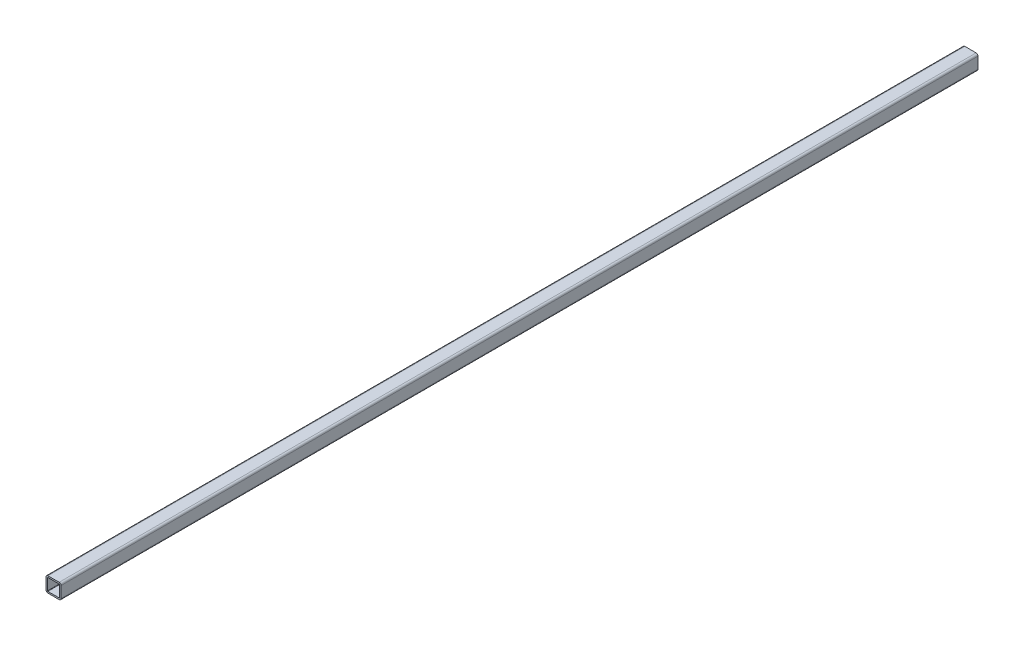
ISO-10303-21;
HEADER;
FILE_DESCRIPTION(('STEP AP214'),'2;1');
FILE_NAME('part.step','',(''),(''),'','','');
FILE_SCHEMA(('AUTOMOTIVE_DESIGN { 1 0 10303 214 1 1 1 1 }'));
ENDSEC;
DATA;
#1=APPLICATION_CONTEXT('core data for automotive mechanical design processes');
#2=APPLICATION_PROTOCOL_DEFINITION('international standard','automotive_design',2000,#1);
#3=PRODUCT_CONTEXT('',#1,'mechanical');
#4=PRODUCT('Part','Part','',(#3));
#5=PRODUCT_RELATED_PRODUCT_CATEGORY('part','',(#4));
#6=PRODUCT_DEFINITION_FORMATION('','',#4);
#7=PRODUCT_DEFINITION_CONTEXT('part definition',#1,'design');
#8=PRODUCT_DEFINITION('design','',#6,#7);
#9=PRODUCT_DEFINITION_SHAPE('','',#8);
#10=(LENGTH_UNIT() NAMED_UNIT(*) SI_UNIT(.MILLI.,.METRE.));
#11=(NAMED_UNIT(*) PLANE_ANGLE_UNIT() SI_UNIT($,.RADIAN.));
#12=(NAMED_UNIT(*) SI_UNIT($,.STERADIAN.) SOLID_ANGLE_UNIT());
#13=UNCERTAINTY_MEASURE_WITH_UNIT(LENGTH_MEASURE(1.E-05),#10,'distance_accuracy_value','');
#14=(GEOMETRIC_REPRESENTATION_CONTEXT(3) GLOBAL_UNCERTAINTY_ASSIGNED_CONTEXT((#13)) GLOBAL_UNIT_ASSIGNED_CONTEXT((#10,
#11,#12)) REPRESENTATION_CONTEXT('',''));
#15=CARTESIAN_POINT('',(0.,0.,0.));
#16=DIRECTION('',(0.,0.,1.));
#17=DIRECTION('',(1.,0.,0.));
#18=AXIS2_PLACEMENT_3D('',#15,#16,#17);
#19=CARTESIAN_POINT('',(-7.5,7.5,609.6));
#20=DIRECTION('',(0.,0.,1.));
#21=DIRECTION('',(1.,0.,0.));
#22=AXIS2_PLACEMENT_3D('',#19,#20,#21);
#23=PLANE('',#22);
#24=CARTESIAN_POINT('',(-7.5,7.5,609.6));
#25=DIRECTION('',(0.,0.,1.));
#26=DIRECTION('',(1.,0.,0.));
#27=AXIS2_PLACEMENT_3D('',#24,#25,#26);
#28=CIRCLE('',#27,2.5);
#29=CARTESIAN_POINT('',(-7.5,10.,609.6));
#30=VERTEX_POINT('',#29);
#31=CARTESIAN_POINT('',(-10.,7.5,609.6));
#32=VERTEX_POINT('',#31);
#33=EDGE_CURVE('E256',#30,#32,#28,.T.);
#34=ORIENTED_EDGE('',*,*,#33,.T.);
#35=DIRECTION('',(0.,-1.,0.));
#36=VECTOR('',#35,1.);
#37=CARTESIAN_POINT('',(-10.,-7.5,609.6));
#38=LINE('',#37,#36);
#39=CARTESIAN_POINT('',(-10.,-7.5,609.6));
#40=VERTEX_POINT('',#39);
#41=EDGE_CURVE('E259',#32,#40,#38,.T.);
#42=ORIENTED_EDGE('',*,*,#41,.T.);
#43=CARTESIAN_POINT('',(-7.5,-7.5,609.6));
#44=DIRECTION('',(0.,0.,1.));
#45=DIRECTION('',(-1.,0.,0.));
#46=AXIS2_PLACEMENT_3D('',#43,#44,#45);
#47=CIRCLE('',#46,2.5);
#48=CARTESIAN_POINT('',(-7.5,-10.,609.6));
#49=VERTEX_POINT('',#48);
#50=EDGE_CURVE('E262',#40,#49,#47,.T.);
#51=ORIENTED_EDGE('',*,*,#50,.T.);
#52=DIRECTION('',(1.,0.,0.));
#53=VECTOR('',#52,1.);
#54=CARTESIAN_POINT('',(7.5,-10.,609.6));
#55=LINE('',#54,#53);
#56=CARTESIAN_POINT('',(7.5,-10.,609.6));
#57=VERTEX_POINT('',#56);
#58=EDGE_CURVE('E264',#49,#57,#55,.T.);
#59=ORIENTED_EDGE('',*,*,#58,.T.);
#60=CARTESIAN_POINT('',(7.5,-7.5,609.6));
#61=DIRECTION('',(0.,0.,1.));
#62=DIRECTION('',(1.,0.,0.));
#63=AXIS2_PLACEMENT_3D('',#60,#61,#62);
#64=CIRCLE('',#63,2.5);
#65=CARTESIAN_POINT('',(10.,-7.5,609.6));
#66=VERTEX_POINT('',#65);
#67=EDGE_CURVE('E266',#57,#66,#64,.T.);
#68=ORIENTED_EDGE('',*,*,#67,.T.);
#69=DIRECTION('',(0.,1.,0.));
#70=VECTOR('',#69,1.);
#71=CARTESIAN_POINT('',(10.,-7.5,609.6));
#72=LINE('',#71,#70);
#73=CARTESIAN_POINT('',(10.,7.5,609.6));
#74=VERTEX_POINT('',#73);
#75=EDGE_CURVE('E268',#66,#74,#72,.T.);
#76=ORIENTED_EDGE('',*,*,#75,.T.);
#77=CARTESIAN_POINT('',(7.5,7.5,609.6));
#78=DIRECTION('',(0.,0.,1.));
#79=DIRECTION('',(1.,0.,0.));
#80=AXIS2_PLACEMENT_3D('',#77,#78,#79);
#81=CIRCLE('',#80,2.5);
#82=CARTESIAN_POINT('',(7.5,10.,609.6));
#83=VERTEX_POINT('',#82);
#84=EDGE_CURVE('E270',#74,#83,#81,.T.);
#85=ORIENTED_EDGE('',*,*,#84,.T.);
#86=DIRECTION('',(-1.,0.,0.));
#87=VECTOR('',#86,1.);
#88=CARTESIAN_POINT('',(7.5,10.,609.6));
#89=LINE('',#88,#87);
#90=EDGE_CURVE('E272',#83,#30,#89,.T.);
#91=ORIENTED_EDGE('',*,*,#90,.T.);
#92=EDGE_LOOP('',(#34,#42,#51,#59,#68,#76,#85,#91));
#93=FACE_BOUND('',#92,.T.);
#94=DIRECTION('',(0.,-1.,0.));
#95=VECTOR('',#94,1.);
#96=CARTESIAN_POINT('',(-8.,-7.5,609.6));
#97=LINE('',#96,#95);
#98=CARTESIAN_POINT('',(-8.,7.5,609.6));
#99=VERTEX_POINT('',#98);
#100=CARTESIAN_POINT('',(-8.,-7.5,609.6));
#101=VERTEX_POINT('',#100);
#102=EDGE_CURVE('E199',#99,#101,#97,.T.);
#103=ORIENTED_EDGE('',*,*,#102,.F.);
#104=CARTESIAN_POINT('',(-7.5,7.5,609.6));
#105=DIRECTION('',(0.,0.,1.));
#106=DIRECTION('',(1.,0.,0.));
#107=AXIS2_PLACEMENT_3D('',#104,#105,#106);
#108=CIRCLE('',#107,0.499999999999999);
#109=CARTESIAN_POINT('',(-7.5,8.,609.6));
#110=VERTEX_POINT('',#109);
#111=EDGE_CURVE('E191',#110,#99,#108,.T.);
#112=ORIENTED_EDGE('',*,*,#111,.F.);
#113=DIRECTION('',(-1.,0.,0.));
#114=VECTOR('',#113,1.);
#115=CARTESIAN_POINT('',(7.5,8.,609.6));
#116=LINE('',#115,#114);
#117=CARTESIAN_POINT('',(7.5,8.,609.6));
#118=VERTEX_POINT('',#117);
#119=EDGE_CURVE('E224',#118,#110,#116,.T.);
#120=ORIENTED_EDGE('',*,*,#119,.F.);
#121=CARTESIAN_POINT('',(7.5,7.5,609.6));
#122=DIRECTION('',(0.,0.,1.));
#123=DIRECTION('',(1.,0.,0.));
#124=AXIS2_PLACEMENT_3D('',#121,#122,#123);
#125=CIRCLE('',#124,0.499999999999999);
#126=CARTESIAN_POINT('',(8.,7.5,609.6));
#127=VERTEX_POINT('',#126);
#128=EDGE_CURVE('E222',#127,#118,#125,.T.);
#129=ORIENTED_EDGE('',*,*,#128,.F.);
#130=DIRECTION('',(0.,1.,0.));
#131=VECTOR('',#130,1.);
#132=CARTESIAN_POINT('',(8.,-7.5,609.6));
#133=LINE('',#132,#131);
#134=CARTESIAN_POINT('',(8.,-7.5,609.6));
#135=VERTEX_POINT('',#134);
#136=EDGE_CURVE('E220',#135,#127,#133,.T.);
#137=ORIENTED_EDGE('',*,*,#136,.F.);
#138=CARTESIAN_POINT('',(7.5,-7.5,609.6));
#139=DIRECTION('',(0.,0.,1.));
#140=DIRECTION('',(1.,0.,0.));
#141=AXIS2_PLACEMENT_3D('',#138,#139,#140);
#142=CIRCLE('',#141,0.500000000000001);
#143=CARTESIAN_POINT('',(7.5,-8.,609.6));
#144=VERTEX_POINT('',#143);
#145=EDGE_CURVE('E218',#144,#135,#142,.T.);
#146=ORIENTED_EDGE('',*,*,#145,.F.);
#147=DIRECTION('',(1.,0.,0.));
#148=VECTOR('',#147,1.);
#149=CARTESIAN_POINT('',(7.5,-8.,609.6));
#150=LINE('',#149,#148);
#151=CARTESIAN_POINT('',(-7.5,-8.,609.6));
#152=VERTEX_POINT('',#151);
#153=EDGE_CURVE('E214',#152,#144,#150,.T.);
#154=ORIENTED_EDGE('',*,*,#153,.F.);
#155=CARTESIAN_POINT('',(-7.5,-7.5,609.6));
#156=DIRECTION('',(0.,0.,1.));
#157=DIRECTION('',(1.,0.,0.));
#158=AXIS2_PLACEMENT_3D('',#155,#156,#157);
#159=CIRCLE('',#158,0.500000000000002);
#160=EDGE_CURVE('E212',#101,#152,#159,.T.);
#161=ORIENTED_EDGE('',*,*,#160,.F.);
#162=EDGE_LOOP('',(#103,#112,#120,#129,#137,#146,#154,#161));
#163=FACE_BOUND('',#162,.T.);
#164=ADVANCED_FACE('F78',(#93,#163),#23,.T.);
#165=CARTESIAN_POINT('',(-7.5,7.5,-609.6));
#166=DIRECTION('',(0.,0.,1.));
#167=DIRECTION('',(1.,0.,0.));
#168=AXIS2_PLACEMENT_3D('',#165,#166,#167);
#169=PLANE('',#168);
#170=CARTESIAN_POINT('',(-7.5,7.5,-609.6));
#171=DIRECTION('',(0.,0.,1.));
#172=DIRECTION('',(1.,0.,0.));
#173=AXIS2_PLACEMENT_3D('',#170,#171,#172);
#174=CIRCLE('',#173,2.5);
#175=CARTESIAN_POINT('',(-7.5,10.,-609.6));
#176=VERTEX_POINT('',#175);
#177=CARTESIAN_POINT('',(-10.,7.5,-609.6));
#178=VERTEX_POINT('',#177);
#179=EDGE_CURVE('E207',#176,#178,#174,.T.);
#180=ORIENTED_EDGE('',*,*,#179,.F.);
#181=DIRECTION('',(-1.,0.,0.));
#182=VECTOR('',#181,1.);
#183=CARTESIAN_POINT('',(7.5,10.,-609.6));
#184=LINE('',#183,#182);
#185=CARTESIAN_POINT('',(7.5,10.,-609.6));
#186=VERTEX_POINT('',#185);
#187=EDGE_CURVE('E260',#186,#176,#184,.T.);
#188=ORIENTED_EDGE('',*,*,#187,.F.);
#189=CARTESIAN_POINT('',(7.5,7.5,-609.6));
#190=DIRECTION('',(0.,0.,1.));
#191=DIRECTION('',(1.,0.,0.));
#192=AXIS2_PLACEMENT_3D('',#189,#190,#191);
#193=CIRCLE('',#192,2.5);
#194=CARTESIAN_POINT('',(10.,7.5,-609.6));
#195=VERTEX_POINT('',#194);
#196=EDGE_CURVE('E287',#195,#186,#193,.T.);
#197=ORIENTED_EDGE('',*,*,#196,.F.);
#198=DIRECTION('',(0.,1.,0.));
#199=VECTOR('',#198,1.);
#200=CARTESIAN_POINT('',(10.,-7.5,-609.6));
#201=LINE('',#200,#199);
#202=CARTESIAN_POINT('',(10.,-7.5,-609.6));
#203=VERTEX_POINT('',#202);
#204=EDGE_CURVE('E285',#203,#195,#201,.T.);
#205=ORIENTED_EDGE('',*,*,#204,.F.);
#206=CARTESIAN_POINT('',(7.5,-7.5,-609.6));
#207=DIRECTION('',(0.,0.,1.));
#208=DIRECTION('',(1.,0.,0.));
#209=AXIS2_PLACEMENT_3D('',#206,#207,#208);
#210=CIRCLE('',#209,2.5);
#211=CARTESIAN_POINT('',(7.5,-10.,-609.6));
#212=VERTEX_POINT('',#211);
#213=EDGE_CURVE('E283',#212,#203,#210,.T.);
#214=ORIENTED_EDGE('',*,*,#213,.F.);
#215=DIRECTION('',(1.,0.,0.));
#216=VECTOR('',#215,1.);
#217=CARTESIAN_POINT('',(7.5,-10.,-609.6));
#218=LINE('',#217,#216);
#219=CARTESIAN_POINT('',(-7.5,-10.,-609.6));
#220=VERTEX_POINT('',#219);
#221=EDGE_CURVE('E281',#220,#212,#218,.T.);
#222=ORIENTED_EDGE('',*,*,#221,.F.);
#223=CARTESIAN_POINT('',(-7.5,-7.5,-609.6));
#224=DIRECTION('',(0.,0.,1.));
#225=DIRECTION('',(-1.,0.,0.));
#226=AXIS2_PLACEMENT_3D('',#223,#224,#225);
#227=CIRCLE('',#226,2.5);
#228=CARTESIAN_POINT('',(-10.,-7.5,-609.6));
#229=VERTEX_POINT('',#228);
#230=EDGE_CURVE('E279',#229,#220,#227,.T.);
#231=ORIENTED_EDGE('',*,*,#230,.F.);
#232=DIRECTION('',(0.,-1.,0.));
#233=VECTOR('',#232,1.);
#234=CARTESIAN_POINT('',(-10.,-7.5,-609.6));
#235=LINE('',#234,#233);
#236=EDGE_CURVE('E277',#178,#229,#235,.T.);
#237=ORIENTED_EDGE('',*,*,#236,.F.);
#238=EDGE_LOOP('',(#180,#188,#197,#205,#214,#222,#231,#237));
#239=FACE_BOUND('',#238,.T.);
#240=CARTESIAN_POINT('',(-7.5,7.5,-609.6));
#241=DIRECTION('',(0.,0.,1.));
#242=DIRECTION('',(1.,0.,0.));
#243=AXIS2_PLACEMENT_3D('',#240,#241,#242);
#244=CIRCLE('',#243,0.499999999999999);
#245=CARTESIAN_POINT('',(-7.5,8.,-609.6));
#246=VERTEX_POINT('',#245);
#247=CARTESIAN_POINT('',(-8.,7.5,-609.6));
#248=VERTEX_POINT('',#247);
#249=EDGE_CURVE('E101',#246,#248,#244,.T.);
#250=ORIENTED_EDGE('',*,*,#249,.T.);
#251=DIRECTION('',(0.,-1.,0.));
#252=VECTOR('',#251,1.);
#253=CARTESIAN_POINT('',(-8.,-7.5,-609.6));
#254=LINE('',#253,#252);
#255=CARTESIAN_POINT('',(-8.,-7.5,-609.6));
#256=VERTEX_POINT('',#255);
#257=EDGE_CURVE('E206',#248,#256,#254,.T.);
#258=ORIENTED_EDGE('',*,*,#257,.T.);
#259=CARTESIAN_POINT('',(-7.5,-7.5,-609.6));
#260=DIRECTION('',(0.,0.,1.));
#261=DIRECTION('',(1.,0.,0.));
#262=AXIS2_PLACEMENT_3D('',#259,#260,#261);
#263=CIRCLE('',#262,0.500000000000002);
#264=CARTESIAN_POINT('',(-7.5,-8.,-609.6));
#265=VERTEX_POINT('',#264);
#266=EDGE_CURVE('E228',#256,#265,#263,.T.);
#267=ORIENTED_EDGE('',*,*,#266,.T.);
#268=DIRECTION('',(1.,0.,0.));
#269=VECTOR('',#268,1.);
#270=CARTESIAN_POINT('',(7.5,-8.,-609.6));
#271=LINE('',#270,#269);
#272=CARTESIAN_POINT('',(7.5,-8.,-609.6));
#273=VERTEX_POINT('',#272);
#274=EDGE_CURVE('E231',#265,#273,#271,.T.);
#275=ORIENTED_EDGE('',*,*,#274,.T.);
#276=CARTESIAN_POINT('',(7.5,-7.5,-609.6));
#277=DIRECTION('',(0.,0.,1.));
#278=DIRECTION('',(1.,0.,0.));
#279=AXIS2_PLACEMENT_3D('',#276,#277,#278);
#280=CIRCLE('',#279,0.500000000000001);
#281=CARTESIAN_POINT('',(8.,-7.5,-609.6));
#282=VERTEX_POINT('',#281);
#283=EDGE_CURVE('E234',#273,#282,#280,.T.);
#284=ORIENTED_EDGE('',*,*,#283,.T.);
#285=DIRECTION('',(0.,1.,0.));
#286=VECTOR('',#285,1.);
#287=CARTESIAN_POINT('',(8.,-7.5,-609.6));
#288=LINE('',#287,#286);
#289=CARTESIAN_POINT('',(8.,7.5,-609.6));
#290=VERTEX_POINT('',#289);
#291=EDGE_CURVE('E237',#282,#290,#288,.T.);
#292=ORIENTED_EDGE('',*,*,#291,.T.);
#293=CARTESIAN_POINT('',(7.5,7.5,-609.6));
#294=DIRECTION('',(0.,0.,1.));
#295=DIRECTION('',(1.,0.,0.));
#296=AXIS2_PLACEMENT_3D('',#293,#294,#295);
#297=CIRCLE('',#296,0.499999999999999);
#298=CARTESIAN_POINT('',(7.5,8.,-609.6));
#299=VERTEX_POINT('',#298);
#300=EDGE_CURVE('E240',#290,#299,#297,.T.);
#301=ORIENTED_EDGE('',*,*,#300,.T.);
#302=DIRECTION('',(-1.,0.,0.));
#303=VECTOR('',#302,1.);
#304=CARTESIAN_POINT('',(7.5,8.,-609.6));
#305=LINE('',#304,#303);
#306=EDGE_CURVE('E200',#299,#246,#305,.T.);
#307=ORIENTED_EDGE('',*,*,#306,.T.);
#308=EDGE_LOOP('',(#250,#258,#267,#275,#284,#292,#301,#307));
#309=FACE_BOUND('',#308,.T.);
#310=ADVANCED_FACE('F317',(#239,#309),#169,.F.);
#311=CARTESIAN_POINT('',(-7.5,7.5,609.6));
#312=DIRECTION('',(0.,0.,-1.));
#313=DIRECTION('',(-1.,0.,0.));
#314=AXIS2_PLACEMENT_3D('',#311,#312,#313);
#315=CYLINDRICAL_SURFACE('',#314,2.5);
#316=ORIENTED_EDGE('',*,*,#179,.T.);
#317=DIRECTION('',(0.,0.,-1.));
#318=VECTOR('',#317,1.);
#319=CARTESIAN_POINT('',(-10.,7.5,609.6));
#320=LINE('',#319,#318);
#321=EDGE_CURVE('E12',#32,#178,#320,.T.);
#322=ORIENTED_EDGE('',*,*,#321,.F.);
#323=ORIENTED_EDGE('',*,*,#33,.F.);
#324=DIRECTION('',(0.,0.,-1.));
#325=VECTOR('',#324,1.);
#326=CARTESIAN_POINT('',(-7.5,10.,609.6));
#327=LINE('',#326,#325);
#328=EDGE_CURVE('E274',#30,#176,#327,.T.);
#329=ORIENTED_EDGE('',*,*,#328,.T.);
#330=EDGE_LOOP('',(#316,#322,#323,#329));
#331=FACE_BOUND('',#330,.T.);
#332=ADVANCED_FACE('F80',(#331),#315,.T.);
#333=CARTESIAN_POINT('',(-10.,-7.5,609.6));
#334=DIRECTION('',(1.,0.,0.));
#335=DIRECTION('',(0.,1.,0.));
#336=AXIS2_PLACEMENT_3D('',#333,#334,#335);
#337=PLANE('',#336);
#338=ORIENTED_EDGE('',*,*,#236,.T.);
#339=DIRECTION('',(0.,0.,-1.));
#340=VECTOR('',#339,1.);
#341=CARTESIAN_POINT('',(-10.,-7.5,609.6));
#342=LINE('',#341,#340);
#343=EDGE_CURVE('E86',#40,#229,#342,.T.);
#344=ORIENTED_EDGE('',*,*,#343,.F.);
#345=ORIENTED_EDGE('',*,*,#41,.F.);
#346=ORIENTED_EDGE('',*,*,#321,.T.);
#347=EDGE_LOOP('',(#338,#344,#345,#346));
#348=FACE_BOUND('',#347,.T.);
#349=ADVANCED_FACE('F334',(#348),#337,.F.);
#350=CARTESIAN_POINT('',(-7.5,-7.5,609.6));
#351=DIRECTION('',(0.,0.,-1.));
#352=DIRECTION('',(-1.,0.,0.));
#353=AXIS2_PLACEMENT_3D('',#350,#351,#352);
#354=CYLINDRICAL_SURFACE('',#353,2.5);
#355=ORIENTED_EDGE('',*,*,#230,.T.);
#356=DIRECTION('',(0.,0.,-1.));
#357=VECTOR('',#356,1.);
#358=CARTESIAN_POINT('',(-7.5,-10.,609.6));
#359=LINE('',#358,#357);
#360=EDGE_CURVE('E304',#49,#220,#359,.T.);
#361=ORIENTED_EDGE('',*,*,#360,.F.);
#362=ORIENTED_EDGE('',*,*,#50,.F.);
#363=ORIENTED_EDGE('',*,*,#343,.T.);
#364=EDGE_LOOP('',(#355,#361,#362,#363));
#365=FACE_BOUND('',#364,.T.);
#366=ADVANCED_FACE('F311',(#365),#354,.T.);
#367=CARTESIAN_POINT('',(7.5,-10.,609.6));
#368=DIRECTION('',(0.,1.,0.));
#369=DIRECTION('',(-1.,0.,0.));
#370=AXIS2_PLACEMENT_3D('',#367,#368,#369);
#371=PLANE('',#370);
#372=ORIENTED_EDGE('',*,*,#221,.T.);
#373=DIRECTION('',(0.,0.,-1.));
#374=VECTOR('',#373,1.);
#375=CARTESIAN_POINT('',(7.5,-10.,609.6));
#376=LINE('',#375,#374);
#377=EDGE_CURVE('E301',#57,#212,#376,.T.);
#378=ORIENTED_EDGE('',*,*,#377,.F.);
#379=ORIENTED_EDGE('',*,*,#58,.F.);
#380=ORIENTED_EDGE('',*,*,#360,.T.);
#381=EDGE_LOOP('',(#372,#378,#379,#380));
#382=FACE_BOUND('',#381,.T.);
#383=ADVANCED_FACE('F323',(#382),#371,.F.);
#384=CARTESIAN_POINT('',(7.5,-7.5,609.6));
#385=DIRECTION('',(0.,0.,-1.));
#386=DIRECTION('',(-1.,0.,0.));
#387=AXIS2_PLACEMENT_3D('',#384,#385,#386);
#388=CYLINDRICAL_SURFACE('',#387,2.5);
#389=ORIENTED_EDGE('',*,*,#213,.T.);
#390=DIRECTION('',(0.,0.,-1.));
#391=VECTOR('',#390,1.);
#392=CARTESIAN_POINT('',(10.,-7.5,609.6));
#393=LINE('',#392,#391);
#394=EDGE_CURVE('E298',#66,#203,#393,.T.);
#395=ORIENTED_EDGE('',*,*,#394,.F.);
#396=ORIENTED_EDGE('',*,*,#67,.F.);
#397=ORIENTED_EDGE('',*,*,#377,.T.);
#398=EDGE_LOOP('',(#389,#395,#396,#397));
#399=FACE_BOUND('',#398,.T.);
#400=ADVANCED_FACE('F327',(#399),#388,.T.);
#401=CARTESIAN_POINT('',(10.,-7.5,609.6));
#402=DIRECTION('',(-1.,0.,0.));
#403=DIRECTION('',(0.,-1.,0.));
#404=AXIS2_PLACEMENT_3D('',#401,#402,#403);
#405=PLANE('',#404);
#406=ORIENTED_EDGE('',*,*,#204,.T.);
#407=DIRECTION('',(0.,0.,-1.));
#408=VECTOR('',#407,1.);
#409=CARTESIAN_POINT('',(10.,7.5,609.6));
#410=LINE('',#409,#408);
#411=EDGE_CURVE('E295',#74,#195,#410,.T.);
#412=ORIENTED_EDGE('',*,*,#411,.F.);
#413=ORIENTED_EDGE('',*,*,#75,.F.);
#414=ORIENTED_EDGE('',*,*,#394,.T.);
#415=EDGE_LOOP('',(#406,#412,#413,#414));
#416=FACE_BOUND('',#415,.T.);
#417=ADVANCED_FACE('F347',(#416),#405,.F.);
#418=CARTESIAN_POINT('',(7.5,7.5,609.6));
#419=DIRECTION('',(0.,0.,-1.));
#420=DIRECTION('',(-1.,0.,0.));
#421=AXIS2_PLACEMENT_3D('',#418,#419,#420);
#422=CYLINDRICAL_SURFACE('',#421,2.5);
#423=ORIENTED_EDGE('',*,*,#196,.T.);
#424=DIRECTION('',(0.,0.,-1.));
#425=VECTOR('',#424,1.);
#426=CARTESIAN_POINT('',(7.5,10.,609.6));
#427=LINE('',#426,#425);
#428=EDGE_CURVE('E292',#83,#186,#427,.T.);
#429=ORIENTED_EDGE('',*,*,#428,.F.);
#430=ORIENTED_EDGE('',*,*,#84,.F.);
#431=ORIENTED_EDGE('',*,*,#411,.T.);
#432=EDGE_LOOP('',(#423,#429,#430,#431));
#433=FACE_BOUND('',#432,.T.);
#434=ADVANCED_FACE('F345',(#433),#422,.T.);
#435=CARTESIAN_POINT('',(7.5,10.,609.6));
#436=DIRECTION('',(0.,-1.,0.));
#437=DIRECTION('',(1.,0.,0.));
#438=AXIS2_PLACEMENT_3D('',#435,#436,#437);
#439=PLANE('',#438);
#440=ORIENTED_EDGE('',*,*,#187,.T.);
#441=ORIENTED_EDGE('',*,*,#328,.F.);
#442=ORIENTED_EDGE('',*,*,#90,.F.);
#443=ORIENTED_EDGE('',*,*,#428,.T.);
#444=EDGE_LOOP('',(#440,#441,#442,#443));
#445=FACE_BOUND('',#444,.T.);
#446=ADVANCED_FACE('F340',(#445),#439,.F.);
#447=CARTESIAN_POINT('',(-7.5,7.5,609.6));
#448=DIRECTION('',(0.,0.,-1.));
#449=DIRECTION('',(-1.,0.,0.));
#450=AXIS2_PLACEMENT_3D('',#447,#448,#449);
#451=CYLINDRICAL_SURFACE('',#450,0.499999999999999);
#452=ORIENTED_EDGE('',*,*,#249,.F.);
#453=DIRECTION('',(0.,0.,-1.));
#454=VECTOR('',#453,1.);
#455=CARTESIAN_POINT('',(-7.5,8.,609.6));
#456=LINE('',#455,#454);
#457=EDGE_CURVE('E195',#110,#246,#456,.T.);
#458=ORIENTED_EDGE('',*,*,#457,.F.);
#459=ORIENTED_EDGE('',*,*,#111,.T.);
#460=DIRECTION('',(0.,0.,-1.));
#461=VECTOR('',#460,1.);
#462=CARTESIAN_POINT('',(-8.,7.5,609.6));
#463=LINE('',#462,#461);
#464=EDGE_CURVE('E194',#99,#248,#463,.T.);
#465=ORIENTED_EDGE('',*,*,#464,.T.);
#466=EDGE_LOOP('',(#452,#458,#459,#465));
#467=FACE_BOUND('',#466,.T.);
#468=ADVANCED_FACE('F193',(#467),#451,.F.);
#469=CARTESIAN_POINT('',(-8.,-7.5,609.6));
#470=DIRECTION('',(1.,0.,0.));
#471=DIRECTION('',(0.,1.,0.));
#472=AXIS2_PLACEMENT_3D('',#469,#470,#471);
#473=PLANE('',#472);
#474=ORIENTED_EDGE('',*,*,#257,.F.);
#475=ORIENTED_EDGE('',*,*,#464,.F.);
#476=ORIENTED_EDGE('',*,*,#102,.T.);
#477=DIRECTION('',(0.,0.,-1.));
#478=VECTOR('',#477,1.);
#479=CARTESIAN_POINT('',(-8.,-7.5,609.6));
#480=LINE('',#479,#478);
#481=EDGE_CURVE('E208',#101,#256,#480,.T.);
#482=ORIENTED_EDGE('',*,*,#481,.T.);
#483=EDGE_LOOP('',(#474,#475,#476,#482));
#484=FACE_BOUND('',#483,.T.);
#485=ADVANCED_FACE('F203',(#484),#473,.T.);
#486=CARTESIAN_POINT('',(-7.5,-7.5,609.6));
#487=DIRECTION('',(0.,0.,-1.));
#488=DIRECTION('',(-1.,0.,0.));
#489=AXIS2_PLACEMENT_3D('',#486,#487,#488);
#490=CYLINDRICAL_SURFACE('',#489,0.500000000000002);
#491=ORIENTED_EDGE('',*,*,#266,.F.);
#492=ORIENTED_EDGE('',*,*,#481,.F.);
#493=ORIENTED_EDGE('',*,*,#160,.T.);
#494=DIRECTION('',(0.,0.,-1.));
#495=VECTOR('',#494,1.);
#496=CARTESIAN_POINT('',(-7.5,-8.,609.6));
#497=LINE('',#496,#495);
#498=EDGE_CURVE('E253',#152,#265,#497,.T.);
#499=ORIENTED_EDGE('',*,*,#498,.T.);
#500=EDGE_LOOP('',(#491,#492,#493,#499));
#501=FACE_BOUND('',#500,.T.);
#502=ADVANCED_FACE('F372',(#501),#490,.F.);
#503=CARTESIAN_POINT('',(7.5,-8.,609.6));
#504=DIRECTION('',(0.,1.,0.));
#505=DIRECTION('',(-1.,0.,0.));
#506=AXIS2_PLACEMENT_3D('',#503,#504,#505);
#507=PLANE('',#506);
#508=ORIENTED_EDGE('',*,*,#274,.F.);
#509=ORIENTED_EDGE('',*,*,#498,.F.);
#510=ORIENTED_EDGE('',*,*,#153,.T.);
#511=DIRECTION('',(0.,0.,-1.));
#512=VECTOR('',#511,1.);
#513=CARTESIAN_POINT('',(7.5,-8.,609.6));
#514=LINE('',#513,#512);
#515=EDGE_CURVE('E251',#144,#273,#514,.T.);
#516=ORIENTED_EDGE('',*,*,#515,.T.);
#517=EDGE_LOOP('',(#508,#509,#510,#516));
#518=FACE_BOUND('',#517,.T.);
#519=ADVANCED_FACE('F376',(#518),#507,.T.);
#520=CARTESIAN_POINT('',(7.5,-7.5,609.6));
#521=DIRECTION('',(0.,0.,-1.));
#522=DIRECTION('',(-1.,0.,0.));
#523=AXIS2_PLACEMENT_3D('',#520,#521,#522);
#524=CYLINDRICAL_SURFACE('',#523,0.500000000000001);
#525=ORIENTED_EDGE('',*,*,#283,.F.);
#526=ORIENTED_EDGE('',*,*,#515,.F.);
#527=ORIENTED_EDGE('',*,*,#145,.T.);
#528=DIRECTION('',(0.,0.,-1.));
#529=VECTOR('',#528,1.);
#530=CARTESIAN_POINT('',(8.,-7.5,609.6));
#531=LINE('',#530,#529);
#532=EDGE_CURVE('E249',#135,#282,#531,.T.);
#533=ORIENTED_EDGE('',*,*,#532,.T.);
#534=EDGE_LOOP('',(#525,#526,#527,#533));
#535=FACE_BOUND('',#534,.T.);
#536=ADVANCED_FACE('F382',(#535),#524,.F.);
#537=CARTESIAN_POINT('',(8.,-7.5,609.6));
#538=DIRECTION('',(-1.,0.,0.));
#539=DIRECTION('',(0.,-1.,0.));
#540=AXIS2_PLACEMENT_3D('',#537,#538,#539);
#541=PLANE('',#540);
#542=ORIENTED_EDGE('',*,*,#291,.F.);
#543=ORIENTED_EDGE('',*,*,#532,.F.);
#544=ORIENTED_EDGE('',*,*,#136,.T.);
#545=DIRECTION('',(0.,0.,-1.));
#546=VECTOR('',#545,1.);
#547=CARTESIAN_POINT('',(8.,7.5,609.6));
#548=LINE('',#547,#546);
#549=EDGE_CURVE('E247',#127,#290,#548,.T.);
#550=ORIENTED_EDGE('',*,*,#549,.T.);
#551=EDGE_LOOP('',(#542,#543,#544,#550));
#552=FACE_BOUND('',#551,.T.);
#553=ADVANCED_FACE('F386',(#552),#541,.T.);
#554=CARTESIAN_POINT('',(7.5,7.5,609.6));
#555=DIRECTION('',(0.,0.,-1.));
#556=DIRECTION('',(-1.,0.,0.));
#557=AXIS2_PLACEMENT_3D('',#554,#555,#556);
#558=CYLINDRICAL_SURFACE('',#557,0.499999999999999);
#559=ORIENTED_EDGE('',*,*,#300,.F.);
#560=ORIENTED_EDGE('',*,*,#549,.F.);
#561=ORIENTED_EDGE('',*,*,#128,.T.);
#562=DIRECTION('',(0.,0.,-1.));
#563=VECTOR('',#562,1.);
#564=CARTESIAN_POINT('',(7.5,8.,609.6));
#565=LINE('',#564,#563);
#566=EDGE_CURVE('E93',#118,#299,#565,.T.);
#567=ORIENTED_EDGE('',*,*,#566,.T.);
#568=EDGE_LOOP('',(#559,#560,#561,#567));
#569=FACE_BOUND('',#568,.T.);
#570=ADVANCED_FACE('F390',(#569),#558,.F.);
#571=CARTESIAN_POINT('',(7.5,8.,609.6));
#572=DIRECTION('',(0.,-1.,0.));
#573=DIRECTION('',(1.,0.,0.));
#574=AXIS2_PLACEMENT_3D('',#571,#572,#573);
#575=PLANE('',#574);
#576=ORIENTED_EDGE('',*,*,#306,.F.);
#577=ORIENTED_EDGE('',*,*,#566,.F.);
#578=ORIENTED_EDGE('',*,*,#119,.T.);
#579=ORIENTED_EDGE('',*,*,#457,.T.);
#580=EDGE_LOOP('',(#576,#577,#578,#579));
#581=FACE_BOUND('',#580,.T.);
#582=ADVANCED_FACE('F394',(#581),#575,.T.);
#583=CLOSED_SHELL('',(#164,#310,#332,#349,#366,#383,#400,#417,#434,#446,#468,#485,#502,#519,
#536,#553,#570,#582));
#584=MANIFOLD_SOLID_BREP('B2',#583);
#585=ADVANCED_BREP_SHAPE_REPRESENTATION('',(#18,#584),#14);
#586=SHAPE_DEFINITION_REPRESENTATION(#9,#585);
ENDSEC;
END-ISO-10303-21;
